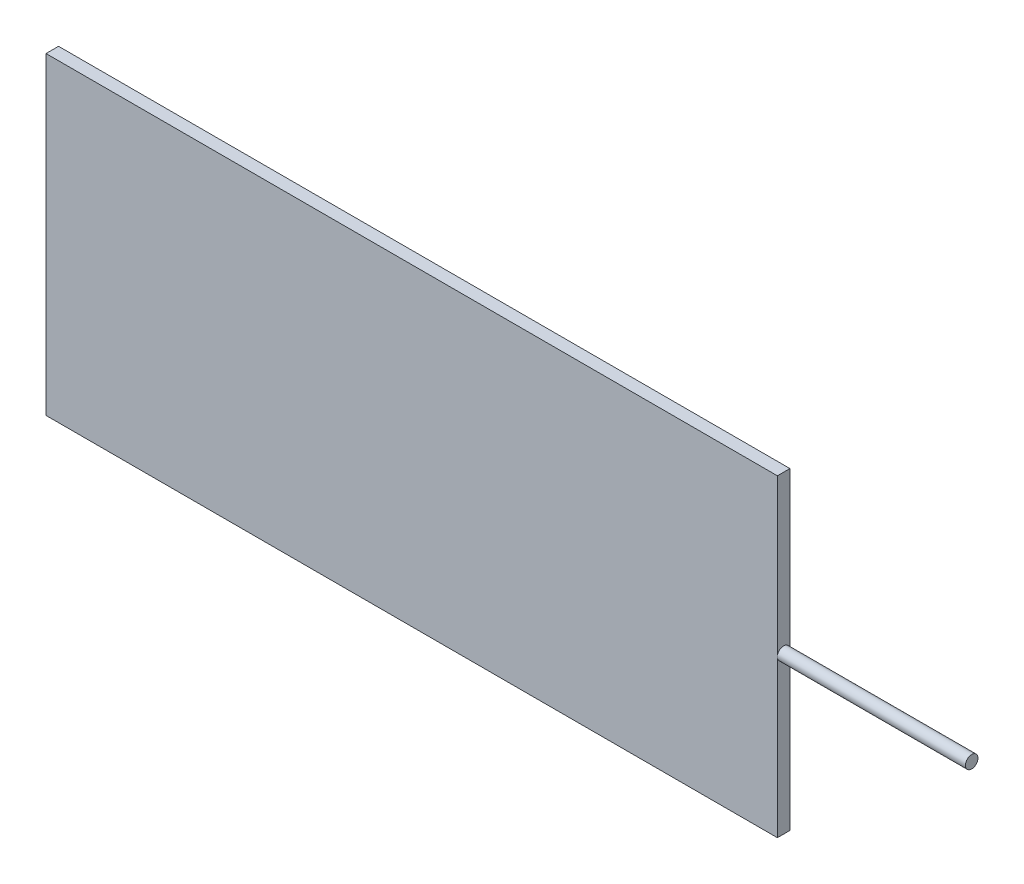
ISO-10303-21;
HEADER;
FILE_DESCRIPTION(('STEP AP214'),'2;1');
FILE_NAME('part.step','',(''),(''),'','','');
FILE_SCHEMA(('AUTOMOTIVE_DESIGN { 1 0 10303 214 1 1 1 1 }'));
ENDSEC;
DATA;
#1=APPLICATION_CONTEXT('core data for automotive mechanical design processes');
#2=APPLICATION_PROTOCOL_DEFINITION('international standard','automotive_design',2000,#1);
#3=PRODUCT_CONTEXT('',#1,'mechanical');
#4=PRODUCT('Part','Part','',(#3));
#5=PRODUCT_RELATED_PRODUCT_CATEGORY('part','',(#4));
#6=PRODUCT_DEFINITION_FORMATION('','',#4);
#7=PRODUCT_DEFINITION_CONTEXT('part definition',#1,'design');
#8=PRODUCT_DEFINITION('design','',#6,#7);
#9=PRODUCT_DEFINITION_SHAPE('','',#8);
#10=(LENGTH_UNIT() NAMED_UNIT(*) SI_UNIT(.MILLI.,.METRE.));
#11=(NAMED_UNIT(*) PLANE_ANGLE_UNIT() SI_UNIT($,.RADIAN.));
#12=(NAMED_UNIT(*) SI_UNIT($,.STERADIAN.) SOLID_ANGLE_UNIT());
#13=UNCERTAINTY_MEASURE_WITH_UNIT(LENGTH_MEASURE(1.E-05),#10,'distance_accuracy_value','');
#14=(GEOMETRIC_REPRESENTATION_CONTEXT(3) GLOBAL_UNCERTAINTY_ASSIGNED_CONTEXT((#13)) GLOBAL_UNIT_ASSIGNED_CONTEXT((#10,
#11,#12)) REPRESENTATION_CONTEXT('',''));
#15=CARTESIAN_POINT('',(0.,0.,0.));
#16=DIRECTION('',(0.,0.,1.));
#17=DIRECTION('',(1.,0.,0.));
#18=AXIS2_PLACEMENT_3D('',#15,#16,#17);
#19=CARTESIAN_POINT('',(350.000000000001,0.,6.00000000000002));
#20=DIRECTION('',(-1.,0.,0.));
#21=DIRECTION('',(0.,0.,1.));
#22=AXIS2_PLACEMENT_3D('',#19,#20,#21);
#23=PLANE('',#22);
#24=CARTESIAN_POINT('',(350.000000000001,74.9999999999996,3.00000000000013));
#25=DIRECTION('',(1.,0.,0.));
#26=DIRECTION('',(0.,0.,-1.));
#27=AXIS2_PLACEMENT_3D('',#24,#25,#26);
#28=CIRCLE('',#27,3.);
#29=CARTESIAN_POINT('',(350.000000000001,74.9999999999996,0.));
#30=VERTEX_POINT('',#29);
#31=CARTESIAN_POINT('',(350.000000000001,74.9999999999996,6.00000000000012));
#32=VERTEX_POINT('',#31);
#33=EDGE_CURVE('E53',#30,#32,#28,.T.);
#34=ORIENTED_EDGE('',*,*,#33,.F.);
#35=DIRECTION('',(0.,0.999999999999994,0.));
#36=VECTOR('',#35,1.);
#37=CARTESIAN_POINT('',(350.000000000001,0.,0.));
#38=LINE('',#37,#36);
#39=CARTESIAN_POINT('',(350.000000000001,149.999999999999,0.));
#40=VERTEX_POINT('',#39);
#41=EDGE_CURVE('E106',#30,#40,#38,.T.);
#42=ORIENTED_EDGE('',*,*,#41,.T.);
#43=DIRECTION('',(0.,0.,-1.));
#44=VECTOR('',#43,1.);
#45=CARTESIAN_POINT('',(350.000000000001,149.999999999999,6.00000000000007));
#46=LINE('',#45,#44);
#47=CARTESIAN_POINT('',(350.000000000001,149.999999999999,6.00000000000007));
#48=VERTEX_POINT('',#47);
#49=EDGE_CURVE('E168',#48,#40,#46,.T.);
#50=ORIENTED_EDGE('',*,*,#49,.F.);
#51=DIRECTION('',(0.,0.999999999999994,0.));
#52=VECTOR('',#51,1.);
#53=CARTESIAN_POINT('',(350.000000000001,0.,6.00000000000002));
#54=LINE('',#53,#52);
#55=EDGE_CURVE('E116',#32,#48,#54,.T.);
#56=ORIENTED_EDGE('',*,*,#55,.F.);
#57=EDGE_LOOP('',(#34,#42,#50,#56));
#58=FACE_BOUND('',#57,.T.);
#59=ADVANCED_FACE('F42',(#58),#23,.F.);
#60=CARTESIAN_POINT('',(0.,0.,6.00000000000001));
#61=DIRECTION('',(1.,0.,0.));
#62=DIRECTION('',(0.,0.,-1.));
#63=AXIS2_PLACEMENT_3D('',#60,#61,#62);
#64=PLANE('',#63);
#65=DIRECTION('',(0.,-0.999999999999994,0.));
#66=VECTOR('',#65,1.);
#67=CARTESIAN_POINT('',(0.,0.,0.));
#68=LINE('',#67,#66);
#69=CARTESIAN_POINT('',(0.,149.999999999999,0.));
#70=VERTEX_POINT('',#69);
#71=CARTESIAN_POINT('',(0.,0.,0.));
#72=VERTEX_POINT('',#71);
#73=EDGE_CURVE('E155',#70,#72,#68,.T.);
#74=ORIENTED_EDGE('',*,*,#73,.T.);
#75=DIRECTION('',(0.,0.,-1.));
#76=VECTOR('',#75,1.);
#77=CARTESIAN_POINT('',(0.,0.,6.00000000000001));
#78=LINE('',#77,#76);
#79=CARTESIAN_POINT('',(0.,0.,6.00000000000001));
#80=VERTEX_POINT('',#79);
#81=EDGE_CURVE('E46',#80,#72,#78,.T.);
#82=ORIENTED_EDGE('',*,*,#81,.F.);
#83=DIRECTION('',(0.,-0.999999999999994,0.));
#84=VECTOR('',#83,1.);
#85=CARTESIAN_POINT('',(0.,0.,6.00000000000001));
#86=LINE('',#85,#84);
#87=CARTESIAN_POINT('',(-1.83186799063151E-12,149.999999999999,6.0000000000002));
#88=VERTEX_POINT('',#87);
#89=EDGE_CURVE('E164',#88,#80,#86,.T.);
#90=ORIENTED_EDGE('',*,*,#89,.F.);
#91=DIRECTION('',(0.,0.,-1.));
#92=VECTOR('',#91,1.);
#93=CARTESIAN_POINT('',(-1.83186799063151E-12,149.999999999999,6.0000000000002));
#94=LINE('',#93,#92);
#95=EDGE_CURVE('E165',#88,#70,#94,.T.);
#96=ORIENTED_EDGE('',*,*,#95,.T.);
#97=EDGE_LOOP('',(#74,#82,#90,#96));
#98=FACE_BOUND('',#97,.T.);
#99=ADVANCED_FACE('F44',(#98),#64,.F.);
#100=CARTESIAN_POINT('',(0.,0.,6.00000000000001));
#101=DIRECTION('',(0.,0.999999999999994,0.));
#102=DIRECTION('',(0.,0.,1.));
#103=AXIS2_PLACEMENT_3D('',#100,#101,#102);
#104=PLANE('',#103);
#105=DIRECTION('',(1.,0.,0.));
#106=VECTOR('',#105,1.);
#107=CARTESIAN_POINT('',(0.,0.,0.));
#108=LINE('',#107,#106);
#109=CARTESIAN_POINT('',(350.000000000001,0.,0.));
#110=VERTEX_POINT('',#109);
#111=EDGE_CURVE('E114',#72,#110,#108,.T.);
#112=ORIENTED_EDGE('',*,*,#111,.T.);
#113=DIRECTION('',(0.,0.,-1.));
#114=VECTOR('',#113,1.);
#115=CARTESIAN_POINT('',(350.000000000001,0.,6.00000000000002));
#116=LINE('',#115,#114);
#117=CARTESIAN_POINT('',(350.000000000001,0.,6.00000000000002));
#118=VERTEX_POINT('',#117);
#119=EDGE_CURVE('E103',#118,#110,#116,.T.);
#120=ORIENTED_EDGE('',*,*,#119,.F.);
#121=DIRECTION('',(1.,0.,0.));
#122=VECTOR('',#121,1.);
#123=CARTESIAN_POINT('',(0.,0.,6.00000000000001));
#124=LINE('',#123,#122);
#125=EDGE_CURVE('E96',#80,#118,#124,.T.);
#126=ORIENTED_EDGE('',*,*,#125,.F.);
#127=ORIENTED_EDGE('',*,*,#81,.T.);
#128=EDGE_LOOP('',(#112,#120,#126,#127));
#129=FACE_BOUND('',#128,.T.);
#130=ADVANCED_FACE('F141',(#129),#104,.F.);
#131=EDGE_CURVE('E11',#32,#30,#28,.T.);
#132=ORIENTED_EDGE('',*,*,#131,.F.);
#133=EDGE_CURVE('E180',#118,#32,#54,.T.);
#134=ORIENTED_EDGE('',*,*,#133,.F.);
#135=ORIENTED_EDGE('',*,*,#119,.T.);
#136=EDGE_CURVE('E100',#110,#30,#38,.T.);
#137=ORIENTED_EDGE('',*,*,#136,.T.);
#138=EDGE_LOOP('',(#132,#134,#135,#137));
#139=FACE_BOUND('',#138,.T.);
#140=ADVANCED_FACE('F102',(#139),#23,.F.);
#141=CARTESIAN_POINT('',(-1.83186799063151E-12,149.999999999999,6.0000000000002));
#142=DIRECTION('',(0.,-0.999999999999994,0.));
#143=DIRECTION('',(0.,0.,-1.));
#144=AXIS2_PLACEMENT_3D('',#141,#142,#143);
#145=PLANE('',#144);
#146=DIRECTION('',(-1.,0.,0.));
#147=VECTOR('',#146,1.);
#148=CARTESIAN_POINT('',(0.,149.999999999999,0.));
#149=LINE('',#148,#147);
#150=EDGE_CURVE('E88',#40,#70,#149,.T.);
#151=ORIENTED_EDGE('',*,*,#150,.T.);
#152=ORIENTED_EDGE('',*,*,#95,.F.);
#153=DIRECTION('',(-1.,0.,0.));
#154=VECTOR('',#153,1.);
#155=CARTESIAN_POINT('',(-1.83186799063151E-12,149.999999999999,6.0000000000002));
#156=LINE('',#155,#154);
#157=EDGE_CURVE('E67',#48,#88,#156,.T.);
#158=ORIENTED_EDGE('',*,*,#157,.F.);
#159=ORIENTED_EDGE('',*,*,#49,.T.);
#160=EDGE_LOOP('',(#151,#152,#158,#159));
#161=FACE_BOUND('',#160,.T.);
#162=ADVANCED_FACE('F145',(#161),#145,.F.);
#163=CARTESIAN_POINT('',(0.,0.,6.00000000000001));
#164=DIRECTION('',(0.,0.,-1.));
#165=DIRECTION('',(-1.,0.,0.));
#166=AXIS2_PLACEMENT_3D('',#163,#164,#165);
#167=PLANE('',#166);
#168=ORIENTED_EDGE('',*,*,#89,.T.);
#169=ORIENTED_EDGE('',*,*,#125,.T.);
#170=ORIENTED_EDGE('',*,*,#133,.T.);
#171=ORIENTED_EDGE('',*,*,#55,.T.);
#172=ORIENTED_EDGE('',*,*,#157,.T.);
#173=EDGE_LOOP('',(#168,#169,#170,#171,#172));
#174=FACE_BOUND('',#173,.T.);
#175=ADVANCED_FACE('F132',(#174),#167,.F.);
#176=CARTESIAN_POINT('',(0.,0.,0.));
#177=DIRECTION('',(0.,0.,-1.));
#178=DIRECTION('',(-1.,0.,0.));
#179=AXIS2_PLACEMENT_3D('',#176,#177,#178);
#180=PLANE('',#179);
#181=ORIENTED_EDGE('',*,*,#73,.F.);
#182=ORIENTED_EDGE('',*,*,#150,.F.);
#183=ORIENTED_EDGE('',*,*,#41,.F.);
#184=ORIENTED_EDGE('',*,*,#136,.F.);
#185=ORIENTED_EDGE('',*,*,#111,.F.);
#186=EDGE_LOOP('',(#181,#182,#183,#184,#185));
#187=FACE_BOUND('',#186,.T.);
#188=ADVANCED_FACE('F110',(#187),#180,.T.);
#189=CARTESIAN_POINT('',(440.000000000001,74.9999999999997,3.00000000000003));
#190=DIRECTION('',(-1.,0.,0.));
#191=DIRECTION('',(0.,0.,1.));
#192=AXIS2_PLACEMENT_3D('',#189,#190,#191);
#193=CYLINDRICAL_SURFACE('',#192,3.);
#194=CARTESIAN_POINT('',(440.000000000001,74.9999999999997,3.00000000000003));
#195=DIRECTION('',(1.,0.,0.));
#196=DIRECTION('',(0.,0.,-1.));
#197=AXIS2_PLACEMENT_3D('',#194,#195,#196);
#198=CIRCLE('',#197,3.);
#199=CARTESIAN_POINT('',(440.000000000001,74.9999999999997,0.));
#200=VERTEX_POINT('',#199);
#201=EDGE_CURVE('E120',#200,#200,#198,.T.);
#202=ORIENTED_EDGE('',*,*,#201,.F.);
#203=EDGE_LOOP('',(#202));
#204=FACE_BOUND('',#203,.T.);
#205=ORIENTED_EDGE('',*,*,#33,.T.);
#206=ORIENTED_EDGE('',*,*,#131,.T.);
#207=EDGE_LOOP('',(#205,#206));
#208=FACE_BOUND('',#207,.T.);
#209=ADVANCED_FACE('F121',(#204,#208),#193,.T.);
#210=CARTESIAN_POINT('',(440.000000000001,74.9999999999997,3.00000000000003));
#211=DIRECTION('',(1.,0.,0.));
#212=DIRECTION('',(0.,0.,-1.));
#213=AXIS2_PLACEMENT_3D('',#210,#211,#212);
#214=PLANE('',#213);
#215=ORIENTED_EDGE('',*,*,#201,.T.);
#216=EDGE_LOOP('',(#215));
#217=FACE_BOUND('',#216,.T.);
#218=ADVANCED_FACE('F123',(#217),#214,.T.);
#219=CLOSED_SHELL('',(#59,#99,#130,#140,#162,#175,#188,#209,#218));
#220=MANIFOLD_SOLID_BREP('B2',#219);
#221=ADVANCED_BREP_SHAPE_REPRESENTATION('',(#18,#220),#14);
#222=SHAPE_DEFINITION_REPRESENTATION(#9,#221);
ENDSEC;
END-ISO-10303-21;
